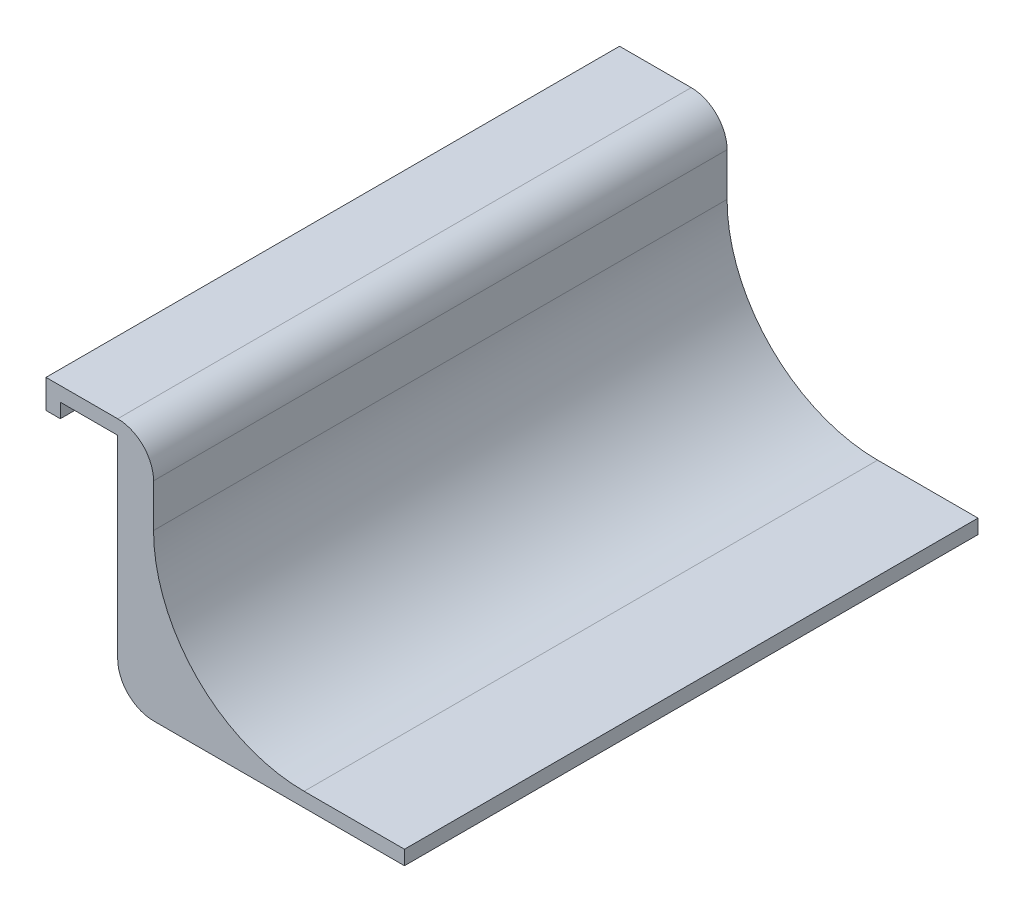
ISO-10303-21;
HEADER;
FILE_DESCRIPTION(('STEP AP214'),'2;1');
FILE_NAME('part.step','',(''),(''),'','','');
FILE_SCHEMA(('AUTOMOTIVE_DESIGN { 1 0 10303 214 1 1 1 1 }'));
ENDSEC;
DATA;
#1=APPLICATION_CONTEXT('core data for automotive mechanical design processes');
#2=APPLICATION_PROTOCOL_DEFINITION('international standard','automotive_design',2000,#1);
#3=PRODUCT_CONTEXT('',#1,'mechanical');
#4=PRODUCT('Part','Part','',(#3));
#5=PRODUCT_RELATED_PRODUCT_CATEGORY('part','',(#4));
#6=PRODUCT_DEFINITION_FORMATION('','',#4);
#7=PRODUCT_DEFINITION_CONTEXT('part definition',#1,'design');
#8=PRODUCT_DEFINITION('design','',#6,#7);
#9=PRODUCT_DEFINITION_SHAPE('','',#8);
#10=(LENGTH_UNIT() NAMED_UNIT(*) SI_UNIT(.MILLI.,.METRE.));
#11=(NAMED_UNIT(*) PLANE_ANGLE_UNIT() SI_UNIT($,.RADIAN.));
#12=(NAMED_UNIT(*) SI_UNIT($,.STERADIAN.) SOLID_ANGLE_UNIT());
#13=UNCERTAINTY_MEASURE_WITH_UNIT(LENGTH_MEASURE(1.E-05),#10,'distance_accuracy_value','');
#14=(GEOMETRIC_REPRESENTATION_CONTEXT(3) GLOBAL_UNCERTAINTY_ASSIGNED_CONTEXT((#13)) GLOBAL_UNIT_ASSIGNED_CONTEXT((#10,
#11,#12)) REPRESENTATION_CONTEXT('',''));
#15=CARTESIAN_POINT('',(0.,0.,0.));
#16=DIRECTION('',(0.,0.,1.));
#17=DIRECTION('',(1.,0.,0.));
#18=AXIS2_PLACEMENT_3D('',#15,#16,#17);
#19=CARTESIAN_POINT('',(-30.,32.,-40.));
#20=DIRECTION('',(0.,1.,0.));
#21=DIRECTION('',(0.,0.,1.));
#22=AXIS2_PLACEMENT_3D('',#19,#20,#21);
#23=PLANE('',#22);
#24=DIRECTION('',(0.,0.,1.));
#25=VECTOR('',#24,1.);
#26=CARTESIAN_POINT('',(-28.,32.,-40.));
#27=LINE('',#26,#25);
#28=CARTESIAN_POINT('',(-28.,32.,-40.));
#29=VERTEX_POINT('',#28);
#30=CARTESIAN_POINT('',(-28.,32.,40.));
#31=VERTEX_POINT('',#30);
#32=EDGE_CURVE('E157',#29,#31,#27,.T.);
#33=ORIENTED_EDGE('',*,*,#32,.F.);
#34=DIRECTION('',(1.,0.,0.));
#35=VECTOR('',#34,1.);
#36=CARTESIAN_POINT('',(-30.,32.,-40.));
#37=LINE('',#36,#35);
#38=CARTESIAN_POINT('',(-20.,32.,-40.));
#39=VERTEX_POINT('',#38);
#40=EDGE_CURVE('E173',#29,#39,#37,.T.);
#41=ORIENTED_EDGE('',*,*,#40,.T.);
#42=DIRECTION('',(0.,0.,1.));
#43=VECTOR('',#42,1.);
#44=CARTESIAN_POINT('',(-20.,32.,-40.));
#45=LINE('',#44,#43);
#46=CARTESIAN_POINT('',(-20.,32.,40.));
#47=VERTEX_POINT('',#46);
#48=EDGE_CURVE('E141',#39,#47,#45,.T.);
#49=ORIENTED_EDGE('',*,*,#48,.T.);
#50=DIRECTION('',(1.,0.,0.));
#51=VECTOR('',#50,1.);
#52=CARTESIAN_POINT('',(-30.,32.,40.));
#53=LINE('',#52,#51);
#54=EDGE_CURVE('E169',#31,#47,#53,.T.);
#55=ORIENTED_EDGE('',*,*,#54,.F.);
#56=EDGE_LOOP('',(#33,#41,#49,#55));
#57=FACE_BOUND('',#56,.T.);
#58=ADVANCED_FACE('F37',(#57),#23,.F.);
#59=CARTESIAN_POINT('',(-20.,2.,-40.));
#60=DIRECTION('',(1.,0.,0.));
#61=DIRECTION('',(0.,0.,-1.));
#62=AXIS2_PLACEMENT_3D('',#59,#60,#61);
#63=PLANE('',#62);
#64=DIRECTION('',(0.,-1.,0.));
#65=VECTOR('',#64,1.);
#66=CARTESIAN_POINT('',(-20.,2.,-40.));
#67=LINE('',#66,#65);
#68=CARTESIAN_POINT('',(-20.,5.,-40.));
#69=VERTEX_POINT('',#68);
#70=EDGE_CURVE('E193',#39,#69,#67,.T.);
#71=ORIENTED_EDGE('',*,*,#70,.T.);
#72=DIRECTION('',(0.,0.,1.));
#73=VECTOR('',#72,1.);
#74=CARTESIAN_POINT('',(-20.,5.,40.));
#75=LINE('',#74,#73);
#76=CARTESIAN_POINT('',(-20.,5.,40.));
#77=VERTEX_POINT('',#76);
#78=EDGE_CURVE('E219',#69,#77,#75,.T.);
#79=ORIENTED_EDGE('',*,*,#78,.T.);
#80=DIRECTION('',(0.,-1.,0.));
#81=VECTOR('',#80,1.);
#82=CARTESIAN_POINT('',(-20.,2.,40.));
#83=LINE('',#82,#81);
#84=EDGE_CURVE('E206',#47,#77,#83,.T.);
#85=ORIENTED_EDGE('',*,*,#84,.F.);
#86=ORIENTED_EDGE('',*,*,#48,.F.);
#87=EDGE_LOOP('',(#71,#79,#85,#86));
#88=FACE_BOUND('',#87,.T.);
#89=ADVANCED_FACE('F266',(#88),#63,.F.);
#90=CARTESIAN_POINT('',(0.,2.,0.));
#91=DIRECTION('',(0.,-1.,0.));
#92=DIRECTION('',(0.,0.,-1.));
#93=AXIS2_PLACEMENT_3D('',#90,#91,#92);
#94=PLANE('',#93);
#95=DIRECTION('',(-1.,0.,0.));
#96=VECTOR('',#95,1.);
#97=CARTESIAN_POINT('',(20.,2.,-40.));
#98=LINE('',#97,#96);
#99=CARTESIAN_POINT('',(20.,2.,-40.));
#100=VERTEX_POINT('',#99);
#101=CARTESIAN_POINT('',(5.99999999999999,2.,-40.));
#102=VERTEX_POINT('',#101);
#103=EDGE_CURVE('E190',#100,#102,#98,.T.);
#104=ORIENTED_EDGE('',*,*,#103,.T.);
#105=DIRECTION('',(0.,0.,-1.));
#106=VECTOR('',#105,1.);
#107=CARTESIAN_POINT('',(6.00000000000001,2.,40.));
#108=LINE('',#107,#106);
#109=CARTESIAN_POINT('',(6.00000000000001,2.,40.));
#110=VERTEX_POINT('',#109);
#111=EDGE_CURVE('E212',#102,#110,#108,.F.);
#112=ORIENTED_EDGE('',*,*,#111,.T.);
#113=DIRECTION('',(1.,0.,0.));
#114=VECTOR('',#113,1.);
#115=CARTESIAN_POINT('',(20.,2.,40.));
#116=LINE('',#115,#114);
#117=CARTESIAN_POINT('',(20.,2.,40.));
#118=VERTEX_POINT('',#117);
#119=EDGE_CURVE('E185',#110,#118,#116,.T.);
#120=ORIENTED_EDGE('',*,*,#119,.T.);
#121=DIRECTION('',(0.,0.,-1.));
#122=VECTOR('',#121,1.);
#123=CARTESIAN_POINT('',(20.,2.,-40.));
#124=LINE('',#123,#122);
#125=EDGE_CURVE('E187',#118,#100,#124,.T.);
#126=ORIENTED_EDGE('',*,*,#125,.T.);
#127=EDGE_LOOP('',(#104,#112,#120,#126));
#128=FACE_BOUND('',#127,.T.);
#129=ADVANCED_FACE('F247',(#128),#94,.F.);
#130=CARTESIAN_POINT('',(20.,2.,40.));
#131=DIRECTION('',(0.,0.,-1.));
#132=DIRECTION('',(-1.,0.,0.));
#133=AXIS2_PLACEMENT_3D('',#130,#131,#132);
#134=PLANE('',#133);
#135=ORIENTED_EDGE('',*,*,#84,.T.);
#136=CARTESIAN_POINT('',(-15.,5.,40.));
#137=DIRECTION('',(0.,0.,-1.));
#138=DIRECTION('',(-1.,0.,0.));
#139=AXIS2_PLACEMENT_3D('',#136,#137,#138);
#140=CIRCLE('',#139,5.);
#141=CARTESIAN_POINT('',(-15.,0.,40.));
#142=VERTEX_POINT('',#141);
#143=EDGE_CURVE('E224',#77,#142,#140,.F.);
#144=ORIENTED_EDGE('',*,*,#143,.T.);
#145=DIRECTION('',(1.,0.,0.));
#146=VECTOR('',#145,1.);
#147=CARTESIAN_POINT('',(20.,0.,40.));
#148=LINE('',#147,#146);
#149=CARTESIAN_POINT('',(20.,0.,40.));
#150=VERTEX_POINT('',#149);
#151=EDGE_CURVE('E184',#142,#150,#148,.T.);
#152=ORIENTED_EDGE('',*,*,#151,.T.);
#153=DIRECTION('',(0.,-1.,0.));
#154=VECTOR('',#153,1.);
#155=CARTESIAN_POINT('',(20.,2.,40.));
#156=LINE('',#155,#154);
#157=EDGE_CURVE('E203',#118,#150,#156,.T.);
#158=ORIENTED_EDGE('',*,*,#157,.F.);
#159=ORIENTED_EDGE('',*,*,#119,.F.);
#160=CARTESIAN_POINT('',(6.00000000000001,23.,40.));
#161=DIRECTION('',(0.,0.,-1.));
#162=DIRECTION('',(-1.,0.,0.));
#163=AXIS2_PLACEMENT_3D('',#160,#161,#162);
#164=CIRCLE('',#163,21.);
#165=CARTESIAN_POINT('',(-15.,23.,40.));
#166=VERTEX_POINT('',#165);
#167=EDGE_CURVE('E216',#110,#166,#164,.T.);
#168=ORIENTED_EDGE('',*,*,#167,.T.);
#169=DIRECTION('',(0.,-1.,0.));
#170=VECTOR('',#169,1.);
#171=CARTESIAN_POINT('',(-15.,34.,40.));
#172=LINE('',#171,#170);
#173=CARTESIAN_POINT('',(-15.,29.,40.));
#174=VERTEX_POINT('',#173);
#175=EDGE_CURVE('E182',#174,#166,#172,.T.);
#176=ORIENTED_EDGE('',*,*,#175,.F.);
#177=CARTESIAN_POINT('',(-20.,29.,40.));
#178=DIRECTION('',(0.,0.,-1.));
#179=DIRECTION('',(-1.,0.,0.));
#180=AXIS2_PLACEMENT_3D('',#177,#178,#179);
#181=CIRCLE('',#180,5.);
#182=CARTESIAN_POINT('',(-20.,34.,40.));
#183=VERTEX_POINT('',#182);
#184=EDGE_CURVE('E222',#174,#183,#181,.F.);
#185=ORIENTED_EDGE('',*,*,#184,.T.);
#186=DIRECTION('',(1.,0.,0.));
#187=VECTOR('',#186,1.);
#188=CARTESIAN_POINT('',(-20.,34.,40.));
#189=LINE('',#188,#187);
#190=CARTESIAN_POINT('',(-30.,34.,40.));
#191=VERTEX_POINT('',#190);
#192=EDGE_CURVE('E175',#191,#183,#189,.T.);
#193=ORIENTED_EDGE('',*,*,#192,.F.);
#194=DIRECTION('',(0.,1.,0.));
#195=VECTOR('',#194,1.);
#196=CARTESIAN_POINT('',(-30.,34.,40.));
#197=LINE('',#196,#195);
#198=CARTESIAN_POINT('',(-30.,30.,40.));
#199=VERTEX_POINT('',#198);
#200=EDGE_CURVE('E140',#199,#191,#197,.T.);
#201=ORIENTED_EDGE('',*,*,#200,.F.);
#202=DIRECTION('',(-1.,0.,0.));
#203=VECTOR('',#202,1.);
#204=CARTESIAN_POINT('',(-30.,30.,40.));
#205=LINE('',#204,#203);
#206=CARTESIAN_POINT('',(-28.,30.,40.));
#207=VERTEX_POINT('',#206);
#208=EDGE_CURVE('E156',#207,#199,#205,.T.);
#209=ORIENTED_EDGE('',*,*,#208,.F.);
#210=DIRECTION('',(0.,1.,0.));
#211=VECTOR('',#210,1.);
#212=CARTESIAN_POINT('',(-28.,30.,40.));
#213=LINE('',#212,#211);
#214=EDGE_CURVE('E162',#207,#31,#213,.T.);
#215=ORIENTED_EDGE('',*,*,#214,.T.);
#216=ORIENTED_EDGE('',*,*,#54,.T.);
#217=EDGE_LOOP('',(#135,#144,#152,#158,#159,#168,#176,#185,#193,#201,#209,#215,#216));
#218=FACE_BOUND('',#217,.T.);
#219=ADVANCED_FACE('F235',(#218),#134,.F.);
#220=CARTESIAN_POINT('',(20.,2.,-40.));
#221=DIRECTION('',(-1.,0.,0.));
#222=DIRECTION('',(0.,0.,1.));
#223=AXIS2_PLACEMENT_3D('',#220,#221,#222);
#224=PLANE('',#223);
#225=DIRECTION('',(0.,0.,-1.));
#226=VECTOR('',#225,1.);
#227=CARTESIAN_POINT('',(20.,0.,-40.));
#228=LINE('',#227,#226);
#229=CARTESIAN_POINT('',(20.,0.,-40.));
#230=VERTEX_POINT('',#229);
#231=EDGE_CURVE('E195',#150,#230,#228,.T.);
#232=ORIENTED_EDGE('',*,*,#231,.T.);
#233=DIRECTION('',(0.,-1.,0.));
#234=VECTOR('',#233,1.);
#235=CARTESIAN_POINT('',(20.,2.,-40.));
#236=LINE('',#235,#234);
#237=EDGE_CURVE('E200',#100,#230,#236,.T.);
#238=ORIENTED_EDGE('',*,*,#237,.F.);
#239=ORIENTED_EDGE('',*,*,#125,.F.);
#240=ORIENTED_EDGE('',*,*,#157,.T.);
#241=EDGE_LOOP('',(#232,#238,#239,#240));
#242=FACE_BOUND('',#241,.T.);
#243=ADVANCED_FACE('F254',(#242),#224,.F.);
#244=CARTESIAN_POINT('',(20.,2.,-40.));
#245=DIRECTION('',(0.,0.,1.));
#246=DIRECTION('',(1.,0.,0.));
#247=AXIS2_PLACEMENT_3D('',#244,#245,#246);
#248=PLANE('',#247);
#249=DIRECTION('',(-1.,0.,0.));
#250=VECTOR('',#249,1.);
#251=CARTESIAN_POINT('',(20.,0.,-40.));
#252=LINE('',#251,#250);
#253=CARTESIAN_POINT('',(-15.,0.,-40.));
#254=VERTEX_POINT('',#253);
#255=EDGE_CURVE('E188',#230,#254,#252,.T.);
#256=ORIENTED_EDGE('',*,*,#255,.T.);
#257=CARTESIAN_POINT('',(-15.,5.,-40.));
#258=DIRECTION('',(0.,0.,1.));
#259=DIRECTION('',(1.,0.,0.));
#260=AXIS2_PLACEMENT_3D('',#257,#258,#259);
#261=CIRCLE('',#260,5.);
#262=EDGE_CURVE('E229',#254,#69,#261,.F.);
#263=ORIENTED_EDGE('',*,*,#262,.T.);
#264=ORIENTED_EDGE('',*,*,#70,.F.);
#265=ORIENTED_EDGE('',*,*,#40,.F.);
#266=DIRECTION('',(0.,1.,0.));
#267=VECTOR('',#266,1.);
#268=CARTESIAN_POINT('',(-28.,30.,-40.));
#269=LINE('',#268,#267);
#270=CARTESIAN_POINT('',(-28.,30.,-40.));
#271=VERTEX_POINT('',#270);
#272=EDGE_CURVE('E148',#271,#29,#269,.T.);
#273=ORIENTED_EDGE('',*,*,#272,.F.);
#274=DIRECTION('',(1.,0.,0.));
#275=VECTOR('',#274,1.);
#276=CARTESIAN_POINT('',(-30.,30.,-40.));
#277=LINE('',#276,#275);
#278=CARTESIAN_POINT('',(-30.,30.,-40.));
#279=VERTEX_POINT('',#278);
#280=EDGE_CURVE('E144',#279,#271,#277,.T.);
#281=ORIENTED_EDGE('',*,*,#280,.F.);
#282=DIRECTION('',(0.,-1.,0.));
#283=VECTOR('',#282,1.);
#284=CARTESIAN_POINT('',(-30.,34.,-40.));
#285=LINE('',#284,#283);
#286=CARTESIAN_POINT('',(-30.,34.,-40.));
#287=VERTEX_POINT('',#286);
#288=EDGE_CURVE('E132',#287,#279,#285,.T.);
#289=ORIENTED_EDGE('',*,*,#288,.F.);
#290=DIRECTION('',(-1.,0.,0.));
#291=VECTOR('',#290,1.);
#292=CARTESIAN_POINT('',(-20.,34.,-40.));
#293=LINE('',#292,#291);
#294=CARTESIAN_POINT('',(-20.,34.,-40.));
#295=VERTEX_POINT('',#294);
#296=EDGE_CURVE('E178',#295,#287,#293,.T.);
#297=ORIENTED_EDGE('',*,*,#296,.F.);
#298=CARTESIAN_POINT('',(-20.,29.,-40.));
#299=DIRECTION('',(0.,0.,1.));
#300=DIRECTION('',(1.,0.,0.));
#301=AXIS2_PLACEMENT_3D('',#298,#299,#300);
#302=CIRCLE('',#301,5.);
#303=CARTESIAN_POINT('',(-15.,29.,-40.));
#304=VERTEX_POINT('',#303);
#305=EDGE_CURVE('E52',#295,#304,#302,.F.);
#306=ORIENTED_EDGE('',*,*,#305,.T.);
#307=DIRECTION('',(0.,-1.,0.));
#308=VECTOR('',#307,1.);
#309=CARTESIAN_POINT('',(-15.,34.,-40.));
#310=LINE('',#309,#308);
#311=CARTESIAN_POINT('',(-15.,23.,-40.));
#312=VERTEX_POINT('',#311);
#313=EDGE_CURVE('E180',#304,#312,#310,.T.);
#314=ORIENTED_EDGE('',*,*,#313,.T.);
#315=CARTESIAN_POINT('',(5.99999999999999,23.,-40.));
#316=DIRECTION('',(0.,0.,1.));
#317=DIRECTION('',(1.,0.,0.));
#318=AXIS2_PLACEMENT_3D('',#315,#316,#317);
#319=CIRCLE('',#318,21.);
#320=EDGE_CURVE('E214',#312,#102,#319,.T.);
#321=ORIENTED_EDGE('',*,*,#320,.T.);
#322=ORIENTED_EDGE('',*,*,#103,.F.);
#323=ORIENTED_EDGE('',*,*,#237,.T.);
#324=EDGE_LOOP('',(#256,#263,#264,#265,#273,#281,#289,#297,#306,#314,#321,#322,#323));
#325=FACE_BOUND('',#324,.T.);
#326=ADVANCED_FACE('F146',(#325),#248,.F.);
#327=CARTESIAN_POINT('',(0.,0.,0.));
#328=DIRECTION('',(0.,-1.,0.));
#329=DIRECTION('',(0.,0.,-1.));
#330=AXIS2_PLACEMENT_3D('',#327,#328,#329);
#331=PLANE('',#330);
#332=ORIENTED_EDGE('',*,*,#151,.F.);
#333=DIRECTION('',(0.,0.,1.));
#334=VECTOR('',#333,1.);
#335=CARTESIAN_POINT('',(-15.,0.,-40.));
#336=LINE('',#335,#334);
#337=EDGE_CURVE('E226',#142,#254,#336,.F.);
#338=ORIENTED_EDGE('',*,*,#337,.T.);
#339=ORIENTED_EDGE('',*,*,#255,.F.);
#340=ORIENTED_EDGE('',*,*,#231,.F.);
#341=EDGE_LOOP('',(#332,#338,#339,#340));
#342=FACE_BOUND('',#341,.T.);
#343=ADVANCED_FACE('F258',(#342),#331,.T.);
#344=CARTESIAN_POINT('',(-15.,34.,-40.));
#345=DIRECTION('',(-1.,0.,0.));
#346=DIRECTION('',(0.,0.,1.));
#347=AXIS2_PLACEMENT_3D('',#344,#345,#346);
#348=PLANE('',#347);
#349=ORIENTED_EDGE('',*,*,#313,.F.);
#350=DIRECTION('',(0.,0.,-1.));
#351=VECTOR('',#350,1.);
#352=CARTESIAN_POINT('',(-15.,29.,40.));
#353=LINE('',#352,#351);
#354=EDGE_CURVE('E11',#304,#174,#353,.F.);
#355=ORIENTED_EDGE('',*,*,#354,.T.);
#356=ORIENTED_EDGE('',*,*,#175,.T.);
#357=DIRECTION('',(0.,0.,-1.));
#358=VECTOR('',#357,1.);
#359=CARTESIAN_POINT('',(-15.,23.,-40.));
#360=LINE('',#359,#358);
#361=EDGE_CURVE('E209',#166,#312,#360,.T.);
#362=ORIENTED_EDGE('',*,*,#361,.T.);
#363=EDGE_LOOP('',(#349,#355,#356,#362));
#364=FACE_BOUND('',#363,.T.);
#365=ADVANCED_FACE('F240',(#364),#348,.F.);
#366=CARTESIAN_POINT('',(0.,34.,0.));
#367=DIRECTION('',(0.,1.,0.));
#368=DIRECTION('',(0.,0.,1.));
#369=AXIS2_PLACEMENT_3D('',#366,#367,#368);
#370=PLANE('',#369);
#371=ORIENTED_EDGE('',*,*,#192,.T.);
#372=DIRECTION('',(0.,0.,-1.));
#373=VECTOR('',#372,1.);
#374=CARTESIAN_POINT('',(-20.,34.,-40.));
#375=LINE('',#374,#373);
#376=EDGE_CURVE('E45',#183,#295,#375,.T.);
#377=ORIENTED_EDGE('',*,*,#376,.T.);
#378=ORIENTED_EDGE('',*,*,#296,.T.);
#379=DIRECTION('',(0.,0.,-1.));
#380=VECTOR('',#379,1.);
#381=CARTESIAN_POINT('',(-30.,34.,-40.));
#382=LINE('',#381,#380);
#383=EDGE_CURVE('E139',#191,#287,#382,.T.);
#384=ORIENTED_EDGE('',*,*,#383,.F.);
#385=EDGE_LOOP('',(#371,#377,#378,#384));
#386=FACE_BOUND('',#385,.T.);
#387=ADVANCED_FACE('F231',(#386),#370,.T.);
#388=CARTESIAN_POINT('',(5.99999999999999,23.,-40.));
#389=DIRECTION('',(0.,0.,1.));
#390=DIRECTION('',(1.,0.,0.));
#391=AXIS2_PLACEMENT_3D('',#388,#389,#390);
#392=CYLINDRICAL_SURFACE('',#391,21.);
#393=ORIENTED_EDGE('',*,*,#167,.F.);
#394=ORIENTED_EDGE('',*,*,#111,.F.);
#395=ORIENTED_EDGE('',*,*,#320,.F.);
#396=ORIENTED_EDGE('',*,*,#361,.F.);
#397=EDGE_LOOP('',(#393,#394,#395,#396));
#398=FACE_BOUND('',#397,.T.);
#399=ADVANCED_FACE('F245',(#398),#392,.F.);
#400=CARTESIAN_POINT('',(-30.,0.,0.));
#401=DIRECTION('',(-1.,0.,0.));
#402=DIRECTION('',(0.,0.,1.));
#403=AXIS2_PLACEMENT_3D('',#400,#401,#402);
#404=PLANE('',#403);
#405=ORIENTED_EDGE('',*,*,#288,.T.);
#406=DIRECTION('',(0.,0.,-1.));
#407=VECTOR('',#406,1.);
#408=CARTESIAN_POINT('',(-30.,30.,-40.));
#409=LINE('',#408,#407);
#410=EDGE_CURVE('E137',#199,#279,#409,.T.);
#411=ORIENTED_EDGE('',*,*,#410,.F.);
#412=ORIENTED_EDGE('',*,*,#200,.T.);
#413=ORIENTED_EDGE('',*,*,#383,.T.);
#414=EDGE_LOOP('',(#405,#411,#412,#413));
#415=FACE_BOUND('',#414,.T.);
#416=ADVANCED_FACE('F134',(#415),#404,.T.);
#417=CARTESIAN_POINT('',(-28.,30.,-40.));
#418=DIRECTION('',(-1.,0.,0.));
#419=DIRECTION('',(0.,0.,1.));
#420=AXIS2_PLACEMENT_3D('',#417,#418,#419);
#421=PLANE('',#420);
#422=ORIENTED_EDGE('',*,*,#32,.T.);
#423=ORIENTED_EDGE('',*,*,#214,.F.);
#424=DIRECTION('',(0.,0.,1.));
#425=VECTOR('',#424,1.);
#426=CARTESIAN_POINT('',(-28.,30.,-40.));
#427=LINE('',#426,#425);
#428=EDGE_CURVE('E151',#271,#207,#427,.T.);
#429=ORIENTED_EDGE('',*,*,#428,.F.);
#430=ORIENTED_EDGE('',*,*,#272,.T.);
#431=EDGE_LOOP('',(#422,#423,#429,#430));
#432=FACE_BOUND('',#431,.T.);
#433=ADVANCED_FACE('F273',(#432),#421,.F.);
#434=CARTESIAN_POINT('',(0.,30.,0.));
#435=DIRECTION('',(0.,1.,0.));
#436=DIRECTION('',(0.,0.,1.));
#437=AXIS2_PLACEMENT_3D('',#434,#435,#436);
#438=PLANE('',#437);
#439=ORIENTED_EDGE('',*,*,#410,.T.);
#440=ORIENTED_EDGE('',*,*,#280,.T.);
#441=ORIENTED_EDGE('',*,*,#428,.T.);
#442=ORIENTED_EDGE('',*,*,#208,.T.);
#443=EDGE_LOOP('',(#439,#440,#441,#442));
#444=FACE_BOUND('',#443,.T.);
#445=ADVANCED_FACE('F154',(#444),#438,.F.);
#446=CARTESIAN_POINT('',(-15.,5.,-40.));
#447=DIRECTION('',(0.,0.,-1.));
#448=DIRECTION('',(-1.,0.,0.));
#449=AXIS2_PLACEMENT_3D('',#446,#447,#448);
#450=CYLINDRICAL_SURFACE('',#449,5.);
#451=ORIENTED_EDGE('',*,*,#262,.F.);
#452=ORIENTED_EDGE('',*,*,#337,.F.);
#453=ORIENTED_EDGE('',*,*,#143,.F.);
#454=ORIENTED_EDGE('',*,*,#78,.F.);
#455=EDGE_LOOP('',(#451,#452,#453,#454));
#456=FACE_BOUND('',#455,.T.);
#457=ADVANCED_FACE('F261',(#456),#450,.T.);
#458=CARTESIAN_POINT('',(-20.,29.,0.));
#459=DIRECTION('',(0.,0.,1.));
#460=DIRECTION('',(1.,0.,0.));
#461=AXIS2_PLACEMENT_3D('',#458,#459,#460);
#462=CYLINDRICAL_SURFACE('',#461,5.);
#463=ORIENTED_EDGE('',*,*,#184,.F.);
#464=ORIENTED_EDGE('',*,*,#354,.F.);
#465=ORIENTED_EDGE('',*,*,#305,.F.);
#466=ORIENTED_EDGE('',*,*,#376,.F.);
#467=EDGE_LOOP('',(#463,#464,#465,#466));
#468=FACE_BOUND('',#467,.T.);
#469=ADVANCED_FACE('F39',(#468),#462,.T.);
#470=CLOSED_SHELL('',(#58,#89,#129,#219,#243,#326,#343,#365,#387,#399,#416,#433,#445,#457,#469));
#471=MANIFOLD_SOLID_BREP('B2',#470);
#472=ADVANCED_BREP_SHAPE_REPRESENTATION('',(#18,#471),#14);
#473=SHAPE_DEFINITION_REPRESENTATION(#9,#472);
ENDSEC;
END-ISO-10303-21;
